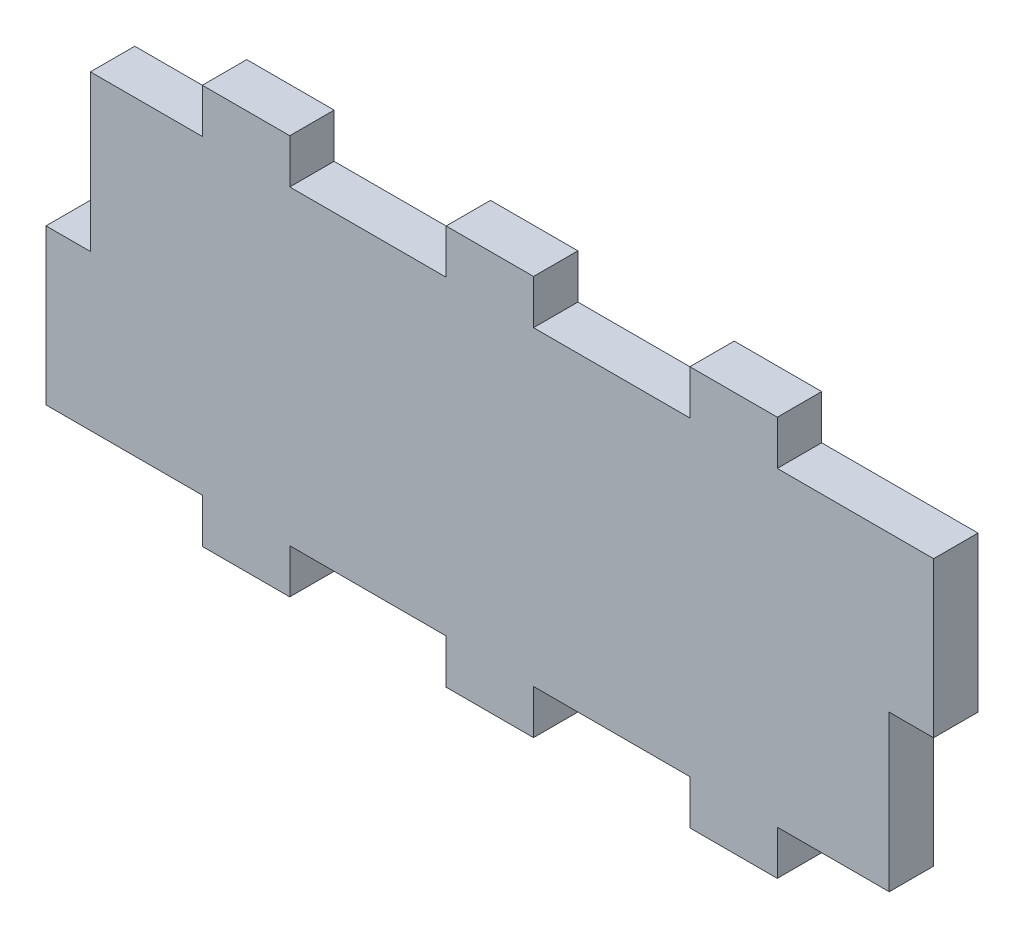
ISO-10303-21;
HEADER;
FILE_DESCRIPTION(('STEP AP214'),'2;1');
FILE_NAME('part.step','',(''),(''),'','','');
FILE_SCHEMA(('AUTOMOTIVE_DESIGN { 1 0 10303 214 1 1 1 1 }'));
ENDSEC;
DATA;
#1=APPLICATION_CONTEXT('core data for automotive mechanical design processes');
#2=APPLICATION_PROTOCOL_DEFINITION('international standard','automotive_design',2000,#1);
#3=PRODUCT_CONTEXT('',#1,'mechanical');
#4=PRODUCT('Part','Part','',(#3));
#5=PRODUCT_RELATED_PRODUCT_CATEGORY('part','',(#4));
#6=PRODUCT_DEFINITION_FORMATION('','',#4);
#7=PRODUCT_DEFINITION_CONTEXT('part definition',#1,'design');
#8=PRODUCT_DEFINITION('design','',#6,#7);
#9=PRODUCT_DEFINITION_SHAPE('','',#8);
#10=(LENGTH_UNIT() NAMED_UNIT(*) SI_UNIT(.MILLI.,.METRE.));
#11=(NAMED_UNIT(*) PLANE_ANGLE_UNIT() SI_UNIT($,.RADIAN.));
#12=(NAMED_UNIT(*) SI_UNIT($,.STERADIAN.) SOLID_ANGLE_UNIT());
#13=UNCERTAINTY_MEASURE_WITH_UNIT(LENGTH_MEASURE(1.E-05),#10,'distance_accuracy_value','');
#14=(GEOMETRIC_REPRESENTATION_CONTEXT(3) GLOBAL_UNCERTAINTY_ASSIGNED_CONTEXT((#13)) GLOBAL_UNIT_ASSIGNED_CONTEXT((#10,
#11,#12)) REPRESENTATION_CONTEXT('',''));
#15=CARTESIAN_POINT('',(0.,0.,0.));
#16=DIRECTION('',(0.,0.,1.));
#17=DIRECTION('',(1.,0.,0.));
#18=AXIS2_PLACEMENT_3D('',#15,#16,#17);
#19=CARTESIAN_POINT('',(0.,-17.5,5.));
#20=DIRECTION('',(0.,1.,0.));
#21=DIRECTION('',(0.,0.,1.));
#22=AXIS2_PLACEMENT_3D('',#19,#20,#21);
#23=PLANE('',#22);
#24=DIRECTION('',(1.,0.,0.));
#25=VECTOR('',#24,1.);
#26=CARTESIAN_POINT('',(0.,-17.5,0.));
#27=LINE('',#26,#25);
#28=CARTESIAN_POINT('',(-50.,-17.5,0.));
#29=VERTEX_POINT('',#28);
#30=CARTESIAN_POINT('',(-32.3875,-17.5,0.));
#31=VERTEX_POINT('',#30);
#32=EDGE_CURVE('E281',#29,#31,#27,.T.);
#33=ORIENTED_EDGE('',*,*,#32,.T.);
#34=DIRECTION('',(0.,0.,-1.));
#35=VECTOR('',#34,1.);
#36=CARTESIAN_POINT('',(-32.3875,-17.5,5.));
#37=LINE('',#36,#35);
#38=CARTESIAN_POINT('',(-32.3875,-17.5,5.));
#39=VERTEX_POINT('',#38);
#40=EDGE_CURVE('E11',#39,#31,#37,.T.);
#41=ORIENTED_EDGE('',*,*,#40,.F.);
#42=DIRECTION('',(1.,0.,0.));
#43=VECTOR('',#42,1.);
#44=CARTESIAN_POINT('',(0.,-17.5,5.));
#45=LINE('',#44,#43);
#46=CARTESIAN_POINT('',(-50.,-17.5,5.));
#47=VERTEX_POINT('',#46);
#48=EDGE_CURVE('E357',#47,#39,#45,.T.);
#49=ORIENTED_EDGE('',*,*,#48,.F.);
#50=DIRECTION('',(0.,0.,-1.));
#51=VECTOR('',#50,1.);
#52=CARTESIAN_POINT('',(-50.,-17.5,5.));
#53=LINE('',#52,#51);
#54=EDGE_CURVE('E52',#47,#29,#53,.T.);
#55=ORIENTED_EDGE('',*,*,#54,.T.);
#56=EDGE_LOOP('',(#33,#41,#49,#55));
#57=FACE_BOUND('',#56,.T.);
#58=ADVANCED_FACE('F35',(#57),#23,.F.);
#59=CARTESIAN_POINT('',(-32.3875,0.,5.));
#60=DIRECTION('',(1.,0.,0.));
#61=DIRECTION('',(0.,0.,-1.));
#62=AXIS2_PLACEMENT_3D('',#59,#60,#61);
#63=PLANE('',#62);
#64=DIRECTION('',(0.,-1.,0.));
#65=VECTOR('',#64,1.);
#66=CARTESIAN_POINT('',(-32.3875,0.,0.));
#67=LINE('',#66,#65);
#68=CARTESIAN_POINT('',(-32.3875,-22.5,0.));
#69=VERTEX_POINT('',#68);
#70=EDGE_CURVE('E283',#31,#69,#67,.T.);
#71=ORIENTED_EDGE('',*,*,#70,.T.);
#72=DIRECTION('',(0.,0.,-1.));
#73=VECTOR('',#72,1.);
#74=CARTESIAN_POINT('',(-32.3875,-22.5,5.));
#75=LINE('',#74,#73);
#76=CARTESIAN_POINT('',(-32.3875,-22.5,5.));
#77=VERTEX_POINT('',#76);
#78=EDGE_CURVE('E44',#77,#69,#75,.T.);
#79=ORIENTED_EDGE('',*,*,#78,.F.);
#80=DIRECTION('',(0.,-1.,0.));
#81=VECTOR('',#80,1.);
#82=CARTESIAN_POINT('',(-32.3875,0.,5.));
#83=LINE('',#82,#81);
#84=EDGE_CURVE('E163',#39,#77,#83,.T.);
#85=ORIENTED_EDGE('',*,*,#84,.F.);
#86=ORIENTED_EDGE('',*,*,#40,.T.);
#87=EDGE_LOOP('',(#71,#79,#85,#86));
#88=FACE_BOUND('',#87,.T.);
#89=ADVANCED_FACE('F37',(#88),#63,.F.);
#90=CARTESIAN_POINT('',(0.,-22.5,5.));
#91=DIRECTION('',(0.,1.,0.));
#92=DIRECTION('',(0.,0.,1.));
#93=AXIS2_PLACEMENT_3D('',#90,#91,#92);
#94=PLANE('',#93);
#95=DIRECTION('',(1.,0.,0.));
#96=VECTOR('',#95,1.);
#97=CARTESIAN_POINT('',(0.,-22.5,0.));
#98=LINE('',#97,#96);
#99=CARTESIAN_POINT('',(-22.5375,-22.5,0.));
#100=VERTEX_POINT('',#99);
#101=EDGE_CURVE('E287',#69,#100,#98,.T.);
#102=ORIENTED_EDGE('',*,*,#101,.T.);
#103=DIRECTION('',(0.,0.,-1.));
#104=VECTOR('',#103,1.);
#105=CARTESIAN_POINT('',(-22.5375,-22.5,5.));
#106=LINE('',#105,#104);
#107=CARTESIAN_POINT('',(-22.5375,-22.5,5.));
#108=VERTEX_POINT('',#107);
#109=EDGE_CURVE('E417',#108,#100,#106,.T.);
#110=ORIENTED_EDGE('',*,*,#109,.F.);
#111=DIRECTION('',(1.,0.,0.));
#112=VECTOR('',#111,1.);
#113=CARTESIAN_POINT('',(0.,-22.5,5.));
#114=LINE('',#113,#112);
#115=EDGE_CURVE('E424',#77,#108,#114,.T.);
#116=ORIENTED_EDGE('',*,*,#115,.F.);
#117=ORIENTED_EDGE('',*,*,#78,.T.);
#118=EDGE_LOOP('',(#102,#110,#116,#117));
#119=FACE_BOUND('',#118,.T.);
#120=ADVANCED_FACE('F422',(#119),#94,.F.);
#121=CARTESIAN_POINT('',(-22.5375,0.,5.));
#122=DIRECTION('',(1.,0.,0.));
#123=DIRECTION('',(0.,0.,-1.));
#124=AXIS2_PLACEMENT_3D('',#121,#122,#123);
#125=PLANE('',#124);
#126=DIRECTION('',(0.,-1.,0.));
#127=VECTOR('',#126,1.);
#128=CARTESIAN_POINT('',(-22.5375,0.,0.));
#129=LINE('',#128,#127);
#130=CARTESIAN_POINT('',(-22.5375,-17.5,0.));
#131=VERTEX_POINT('',#130);
#132=EDGE_CURVE('E290',#131,#100,#129,.T.);
#133=ORIENTED_EDGE('',*,*,#132,.F.);
#134=DIRECTION('',(0.,0.,-1.));
#135=VECTOR('',#134,1.);
#136=CARTESIAN_POINT('',(-22.5375,-17.5,5.));
#137=LINE('',#136,#135);
#138=CARTESIAN_POINT('',(-22.5375,-17.5,5.));
#139=VERTEX_POINT('',#138);
#140=EDGE_CURVE('E415',#139,#131,#137,.T.);
#141=ORIENTED_EDGE('',*,*,#140,.F.);
#142=DIRECTION('',(0.,-1.,0.));
#143=VECTOR('',#142,1.);
#144=CARTESIAN_POINT('',(-22.5375,0.,5.));
#145=LINE('',#144,#143);
#146=EDGE_CURVE('E435',#139,#108,#145,.T.);
#147=ORIENTED_EDGE('',*,*,#146,.T.);
#148=ORIENTED_EDGE('',*,*,#109,.T.);
#149=EDGE_LOOP('',(#133,#141,#147,#148));
#150=FACE_BOUND('',#149,.T.);
#151=ADVANCED_FACE('F431',(#150),#125,.T.);
#152=CARTESIAN_POINT('',(-4.92499999999999,-17.5,0.));
#153=VERTEX_POINT('',#152);
#154=EDGE_CURVE('E285',#131,#153,#27,.T.);
#155=ORIENTED_EDGE('',*,*,#154,.T.);
#156=DIRECTION('',(0.,0.,-1.));
#157=VECTOR('',#156,1.);
#158=CARTESIAN_POINT('',(-4.92499999999999,-17.5,5.));
#159=LINE('',#158,#157);
#160=CARTESIAN_POINT('',(-4.92499999999999,-17.5,5.));
#161=VERTEX_POINT('',#160);
#162=EDGE_CURVE('E412',#161,#153,#159,.T.);
#163=ORIENTED_EDGE('',*,*,#162,.F.);
#164=EDGE_CURVE('E436',#139,#161,#45,.T.);
#165=ORIENTED_EDGE('',*,*,#164,.F.);
#166=ORIENTED_EDGE('',*,*,#140,.T.);
#167=EDGE_LOOP('',(#155,#163,#165,#166));
#168=FACE_BOUND('',#167,.T.);
#169=ADVANCED_FACE('F511',(#168),#23,.F.);
#170=CARTESIAN_POINT('',(-4.92499999999999,0.,5.));
#171=DIRECTION('',(1.,0.,0.));
#172=DIRECTION('',(0.,0.,-1.));
#173=AXIS2_PLACEMENT_3D('',#170,#171,#172);
#174=PLANE('',#173);
#175=DIRECTION('',(0.,-1.,0.));
#176=VECTOR('',#175,1.);
#177=CARTESIAN_POINT('',(-4.92499999999999,0.,0.));
#178=LINE('',#177,#176);
#179=CARTESIAN_POINT('',(-4.92499999999999,-22.5,0.));
#180=VERTEX_POINT('',#179);
#181=EDGE_CURVE('E293',#153,#180,#178,.T.);
#182=ORIENTED_EDGE('',*,*,#181,.T.);
#183=DIRECTION('',(0.,0.,-1.));
#184=VECTOR('',#183,1.);
#185=CARTESIAN_POINT('',(-4.92499999999999,-22.5,5.));
#186=LINE('',#185,#184);
#187=CARTESIAN_POINT('',(-4.92499999999999,-22.5,5.));
#188=VERTEX_POINT('',#187);
#189=EDGE_CURVE('E409',#188,#180,#186,.T.);
#190=ORIENTED_EDGE('',*,*,#189,.F.);
#191=DIRECTION('',(0.,-1.,0.));
#192=VECTOR('',#191,1.);
#193=CARTESIAN_POINT('',(-4.92499999999999,0.,5.));
#194=LINE('',#193,#192);
#195=EDGE_CURVE('E438',#161,#188,#194,.T.);
#196=ORIENTED_EDGE('',*,*,#195,.F.);
#197=ORIENTED_EDGE('',*,*,#162,.T.);
#198=EDGE_LOOP('',(#182,#190,#196,#197));
#199=FACE_BOUND('',#198,.T.);
#200=ADVANCED_FACE('F519',(#199),#174,.F.);
#201=CARTESIAN_POINT('',(0.,-22.5,5.));
#202=DIRECTION('',(0.,1.,0.));
#203=DIRECTION('',(0.,0.,1.));
#204=AXIS2_PLACEMENT_3D('',#201,#202,#203);
#205=PLANE('',#204);
#206=DIRECTION('',(1.,0.,0.));
#207=VECTOR('',#206,1.);
#208=CARTESIAN_POINT('',(0.,-22.5,0.));
#209=LINE('',#208,#207);
#210=CARTESIAN_POINT('',(4.92500000000001,-22.5,0.));
#211=VERTEX_POINT('',#210);
#212=EDGE_CURVE('E295',#180,#211,#209,.T.);
#213=ORIENTED_EDGE('',*,*,#212,.T.);
#214=DIRECTION('',(0.,0.,-1.));
#215=VECTOR('',#214,1.);
#216=CARTESIAN_POINT('',(4.92500000000001,-22.5,5.));
#217=LINE('',#216,#215);
#218=CARTESIAN_POINT('',(4.92500000000001,-22.5,5.));
#219=VERTEX_POINT('',#218);
#220=EDGE_CURVE('E407',#219,#211,#217,.T.);
#221=ORIENTED_EDGE('',*,*,#220,.F.);
#222=DIRECTION('',(1.,0.,0.));
#223=VECTOR('',#222,1.);
#224=CARTESIAN_POINT('',(0.,-22.5,5.));
#225=LINE('',#224,#223);
#226=EDGE_CURVE('E445',#188,#219,#225,.T.);
#227=ORIENTED_EDGE('',*,*,#226,.F.);
#228=ORIENTED_EDGE('',*,*,#189,.T.);
#229=EDGE_LOOP('',(#213,#221,#227,#228));
#230=FACE_BOUND('',#229,.T.);
#231=ADVANCED_FACE('F544',(#230),#205,.F.);
#232=CARTESIAN_POINT('',(4.92500000000001,0.,5.));
#233=DIRECTION('',(1.,0.,0.));
#234=DIRECTION('',(0.,0.,-1.));
#235=AXIS2_PLACEMENT_3D('',#232,#233,#234);
#236=PLANE('',#235);
#237=DIRECTION('',(0.,-1.,0.));
#238=VECTOR('',#237,1.);
#239=CARTESIAN_POINT('',(4.92500000000001,0.,0.));
#240=LINE('',#239,#238);
#241=CARTESIAN_POINT('',(4.92500000000001,-17.5,0.));
#242=VERTEX_POINT('',#241);
#243=EDGE_CURVE('E298',#242,#211,#240,.T.);
#244=ORIENTED_EDGE('',*,*,#243,.F.);
#245=DIRECTION('',(0.,0.,-1.));
#246=VECTOR('',#245,1.);
#247=CARTESIAN_POINT('',(4.92500000000001,-17.5,5.));
#248=LINE('',#247,#246);
#249=CARTESIAN_POINT('',(4.92500000000001,-17.5,5.));
#250=VERTEX_POINT('',#249);
#251=EDGE_CURVE('E405',#250,#242,#248,.T.);
#252=ORIENTED_EDGE('',*,*,#251,.F.);
#253=DIRECTION('',(0.,-1.,0.));
#254=VECTOR('',#253,1.);
#255=CARTESIAN_POINT('',(4.92500000000001,0.,5.));
#256=LINE('',#255,#254);
#257=EDGE_CURVE('E447',#250,#219,#256,.T.);
#258=ORIENTED_EDGE('',*,*,#257,.T.);
#259=ORIENTED_EDGE('',*,*,#220,.T.);
#260=EDGE_LOOP('',(#244,#252,#258,#259));
#261=FACE_BOUND('',#260,.T.);
#262=ADVANCED_FACE('F536',(#261),#236,.T.);
#263=CARTESIAN_POINT('',(22.5375,-17.5,0.));
#264=VERTEX_POINT('',#263);
#265=EDGE_CURVE('E301',#242,#264,#27,.T.);
#266=ORIENTED_EDGE('',*,*,#265,.T.);
#267=DIRECTION('',(0.,0.,-1.));
#268=VECTOR('',#267,1.);
#269=CARTESIAN_POINT('',(22.5375,-17.5,5.));
#270=LINE('',#269,#268);
#271=CARTESIAN_POINT('',(22.5375,-17.5,5.));
#272=VERTEX_POINT('',#271);
#273=EDGE_CURVE('E402',#272,#264,#270,.T.);
#274=ORIENTED_EDGE('',*,*,#273,.F.);
#275=EDGE_CURVE('E440',#250,#272,#45,.T.);
#276=ORIENTED_EDGE('',*,*,#275,.F.);
#277=ORIENTED_EDGE('',*,*,#251,.T.);
#278=EDGE_LOOP('',(#266,#274,#276,#277));
#279=FACE_BOUND('',#278,.T.);
#280=ADVANCED_FACE('F521',(#279),#23,.F.);
#281=CARTESIAN_POINT('',(22.5375,0.,5.));
#282=DIRECTION('',(1.,0.,0.));
#283=DIRECTION('',(0.,1.,0.));
#284=AXIS2_PLACEMENT_3D('',#281,#282,#283);
#285=PLANE('',#284);
#286=DIRECTION('',(0.,-1.,0.));
#287=VECTOR('',#286,1.);
#288=CARTESIAN_POINT('',(22.5375,0.,0.));
#289=LINE('',#288,#287);
#290=CARTESIAN_POINT('',(22.5375,-22.5,0.));
#291=VERTEX_POINT('',#290);
#292=EDGE_CURVE('E302',#264,#291,#289,.T.);
#293=ORIENTED_EDGE('',*,*,#292,.T.);
#294=DIRECTION('',(0.,0.,-1.));
#295=VECTOR('',#294,1.);
#296=CARTESIAN_POINT('',(22.5375,-22.5,5.));
#297=LINE('',#296,#295);
#298=CARTESIAN_POINT('',(22.5375,-22.5,5.));
#299=VERTEX_POINT('',#298);
#300=EDGE_CURVE('E399',#299,#291,#297,.T.);
#301=ORIENTED_EDGE('',*,*,#300,.F.);
#302=DIRECTION('',(0.,-1.,0.));
#303=VECTOR('',#302,1.);
#304=CARTESIAN_POINT('',(22.5375,0.,5.));
#305=LINE('',#304,#303);
#306=EDGE_CURVE('E450',#272,#299,#305,.T.);
#307=ORIENTED_EDGE('',*,*,#306,.F.);
#308=ORIENTED_EDGE('',*,*,#273,.T.);
#309=EDGE_LOOP('',(#293,#301,#307,#308));
#310=FACE_BOUND('',#309,.T.);
#311=ADVANCED_FACE('F535',(#310),#285,.F.);
#312=CARTESIAN_POINT('',(0.,-22.5,5.));
#313=DIRECTION('',(0.,1.,0.));
#314=DIRECTION('',(0.,0.,1.));
#315=AXIS2_PLACEMENT_3D('',#312,#313,#314);
#316=PLANE('',#315);
#317=DIRECTION('',(1.,0.,0.));
#318=VECTOR('',#317,1.);
#319=CARTESIAN_POINT('',(0.,-22.5,0.));
#320=LINE('',#319,#318);
#321=CARTESIAN_POINT('',(32.3875,-22.5,0.));
#322=VERTEX_POINT('',#321);
#323=EDGE_CURVE('E304',#291,#322,#320,.T.);
#324=ORIENTED_EDGE('',*,*,#323,.T.);
#325=DIRECTION('',(0.,0.,-1.));
#326=VECTOR('',#325,1.);
#327=CARTESIAN_POINT('',(32.3875,-22.5,5.));
#328=LINE('',#327,#326);
#329=CARTESIAN_POINT('',(32.3875,-22.5,5.));
#330=VERTEX_POINT('',#329);
#331=EDGE_CURVE('E397',#330,#322,#328,.T.);
#332=ORIENTED_EDGE('',*,*,#331,.F.);
#333=DIRECTION('',(1.,0.,0.));
#334=VECTOR('',#333,1.);
#335=CARTESIAN_POINT('',(0.,-22.5,5.));
#336=LINE('',#335,#334);
#337=EDGE_CURVE('E452',#299,#330,#336,.T.);
#338=ORIENTED_EDGE('',*,*,#337,.F.);
#339=ORIENTED_EDGE('',*,*,#300,.T.);
#340=EDGE_LOOP('',(#324,#332,#338,#339));
#341=FACE_BOUND('',#340,.T.);
#342=ADVANCED_FACE('F532',(#341),#316,.F.);
#343=CARTESIAN_POINT('',(32.3875,0.,5.));
#344=DIRECTION('',(1.,0.,0.));
#345=DIRECTION('',(0.,0.,-1.));
#346=AXIS2_PLACEMENT_3D('',#343,#344,#345);
#347=PLANE('',#346);
#348=DIRECTION('',(0.,-1.,0.));
#349=VECTOR('',#348,1.);
#350=CARTESIAN_POINT('',(32.3875,0.,0.));
#351=LINE('',#350,#349);
#352=CARTESIAN_POINT('',(32.3875,-17.5,0.));
#353=VERTEX_POINT('',#352);
#354=EDGE_CURVE('E307',#353,#322,#351,.T.);
#355=ORIENTED_EDGE('',*,*,#354,.F.);
#356=DIRECTION('',(0.,0.,-1.));
#357=VECTOR('',#356,1.);
#358=CARTESIAN_POINT('',(32.3875,-17.5,5.));
#359=LINE('',#358,#357);
#360=CARTESIAN_POINT('',(32.3875,-17.5,5.));
#361=VERTEX_POINT('',#360);
#362=EDGE_CURVE('E395',#361,#353,#359,.T.);
#363=ORIENTED_EDGE('',*,*,#362,.F.);
#364=DIRECTION('',(0.,-1.,0.));
#365=VECTOR('',#364,1.);
#366=CARTESIAN_POINT('',(32.3875,0.,5.));
#367=LINE('',#366,#365);
#368=EDGE_CURVE('E454',#361,#330,#367,.T.);
#369=ORIENTED_EDGE('',*,*,#368,.T.);
#370=ORIENTED_EDGE('',*,*,#331,.T.);
#371=EDGE_LOOP('',(#355,#363,#369,#370));
#372=FACE_BOUND('',#371,.T.);
#373=ADVANCED_FACE('F524',(#372),#347,.T.);
#374=CARTESIAN_POINT('',(45.,-17.5,0.));
#375=VERTEX_POINT('',#374);
#376=EDGE_CURVE('E284',#353,#375,#27,.T.);
#377=ORIENTED_EDGE('',*,*,#376,.T.);
#378=DIRECTION('',(0.,0.,-1.));
#379=VECTOR('',#378,1.);
#380=CARTESIAN_POINT('',(45.,-17.5,5.));
#381=LINE('',#380,#379);
#382=CARTESIAN_POINT('',(45.,-17.5,5.));
#383=VERTEX_POINT('',#382);
#384=EDGE_CURVE('E392',#383,#375,#381,.T.);
#385=ORIENTED_EDGE('',*,*,#384,.F.);
#386=EDGE_CURVE('E457',#361,#383,#45,.T.);
#387=ORIENTED_EDGE('',*,*,#386,.F.);
#388=ORIENTED_EDGE('',*,*,#362,.T.);
#389=EDGE_LOOP('',(#377,#385,#387,#388));
#390=FACE_BOUND('',#389,.T.);
#391=ADVANCED_FACE('F512',(#390),#23,.F.);
#392=CARTESIAN_POINT('',(45.,0.,5.));
#393=DIRECTION('',(-1.,0.,0.));
#394=DIRECTION('',(0.,0.,1.));
#395=AXIS2_PLACEMENT_3D('',#392,#393,#394);
#396=PLANE('',#395);
#397=DIRECTION('',(0.,1.,0.));
#398=VECTOR('',#397,1.);
#399=CARTESIAN_POINT('',(45.,0.,0.));
#400=LINE('',#399,#398);
#401=CARTESIAN_POINT('',(45.,0.0249999999999972,0.));
#402=VERTEX_POINT('',#401);
#403=EDGE_CURVE('E310',#375,#402,#400,.T.);
#404=ORIENTED_EDGE('',*,*,#403,.T.);
#405=DIRECTION('',(0.,0.,-1.));
#406=VECTOR('',#405,1.);
#407=CARTESIAN_POINT('',(45.,0.0249999999999972,5.));
#408=LINE('',#407,#406);
#409=CARTESIAN_POINT('',(45.,0.0249999999999972,5.));
#410=VERTEX_POINT('',#409);
#411=EDGE_CURVE('E389',#410,#402,#408,.T.);
#412=ORIENTED_EDGE('',*,*,#411,.F.);
#413=DIRECTION('',(0.,1.,0.));
#414=VECTOR('',#413,1.);
#415=CARTESIAN_POINT('',(45.,0.,5.));
#416=LINE('',#415,#414);
#417=EDGE_CURVE('E458',#383,#410,#416,.T.);
#418=ORIENTED_EDGE('',*,*,#417,.F.);
#419=ORIENTED_EDGE('',*,*,#384,.T.);
#420=EDGE_LOOP('',(#404,#412,#418,#419));
#421=FACE_BOUND('',#420,.T.);
#422=ADVANCED_FACE('F523',(#421),#396,.F.);
#423=CARTESIAN_POINT('',(0.,0.0249999999999972,5.));
#424=DIRECTION('',(0.,1.,0.));
#425=DIRECTION('',(0.,0.,1.));
#426=AXIS2_PLACEMENT_3D('',#423,#424,#425);
#427=PLANE('',#426);
#428=DIRECTION('',(1.,0.,0.));
#429=VECTOR('',#428,1.);
#430=CARTESIAN_POINT('',(0.,0.0249999999999972,0.));
#431=LINE('',#430,#429);
#432=CARTESIAN_POINT('',(50.,0.0249999999999972,0.));
#433=VERTEX_POINT('',#432);
#434=EDGE_CURVE('E312',#402,#433,#431,.T.);
#435=ORIENTED_EDGE('',*,*,#434,.T.);
#436=DIRECTION('',(0.,0.,-1.));
#437=VECTOR('',#436,1.);
#438=CARTESIAN_POINT('',(50.,0.0249999999999972,5.));
#439=LINE('',#438,#437);
#440=CARTESIAN_POINT('',(50.,0.0249999999999972,5.));
#441=VERTEX_POINT('',#440);
#442=EDGE_CURVE('E387',#441,#433,#439,.T.);
#443=ORIENTED_EDGE('',*,*,#442,.F.);
#444=DIRECTION('',(1.,0.,0.));
#445=VECTOR('',#444,1.);
#446=CARTESIAN_POINT('',(0.,0.0249999999999972,5.));
#447=LINE('',#446,#445);
#448=EDGE_CURVE('E460',#410,#441,#447,.T.);
#449=ORIENTED_EDGE('',*,*,#448,.F.);
#450=ORIENTED_EDGE('',*,*,#411,.T.);
#451=EDGE_LOOP('',(#435,#443,#449,#450));
#452=FACE_BOUND('',#451,.T.);
#453=ADVANCED_FACE('F530',(#452),#427,.F.);
#454=CARTESIAN_POINT('',(50.,0.,5.));
#455=DIRECTION('',(1.,0.,0.));
#456=DIRECTION('',(0.,1.,0.));
#457=AXIS2_PLACEMENT_3D('',#454,#455,#456);
#458=PLANE('',#457);
#459=DIRECTION('',(0.,-1.,0.));
#460=VECTOR('',#459,1.);
#461=CARTESIAN_POINT('',(50.,0.,0.));
#462=LINE('',#461,#460);
#463=CARTESIAN_POINT('',(50.,17.5,0.));
#464=VERTEX_POINT('',#463);
#465=EDGE_CURVE('E315',#464,#433,#462,.T.);
#466=ORIENTED_EDGE('',*,*,#465,.F.);
#467=DIRECTION('',(0.,0.,-1.));
#468=VECTOR('',#467,1.);
#469=CARTESIAN_POINT('',(50.,17.5,5.));
#470=LINE('',#469,#468);
#471=CARTESIAN_POINT('',(50.,17.5,5.));
#472=VERTEX_POINT('',#471);
#473=EDGE_CURVE('E385',#472,#464,#470,.T.);
#474=ORIENTED_EDGE('',*,*,#473,.F.);
#475=DIRECTION('',(0.,-1.,0.));
#476=VECTOR('',#475,1.);
#477=CARTESIAN_POINT('',(50.,0.,5.));
#478=LINE('',#477,#476);
#479=EDGE_CURVE('E462',#472,#441,#478,.T.);
#480=ORIENTED_EDGE('',*,*,#479,.T.);
#481=ORIENTED_EDGE('',*,*,#442,.T.);
#482=EDGE_LOOP('',(#466,#474,#480,#481));
#483=FACE_BOUND('',#482,.T.);
#484=ADVANCED_FACE('F634',(#483),#458,.T.);
#485=CARTESIAN_POINT('',(0.,17.5,5.));
#486=DIRECTION('',(0.,1.,0.));
#487=DIRECTION('',(0.,0.,1.));
#488=AXIS2_PLACEMENT_3D('',#485,#486,#487);
#489=PLANE('',#488);
#490=DIRECTION('',(1.,0.,0.));
#491=VECTOR('',#490,1.);
#492=CARTESIAN_POINT('',(0.,17.5,0.));
#493=LINE('',#492,#491);
#494=CARTESIAN_POINT('',(32.3874999999999,17.5,0.));
#495=VERTEX_POINT('',#494);
#496=EDGE_CURVE('E318',#495,#464,#493,.T.);
#497=ORIENTED_EDGE('',*,*,#496,.F.);
#498=DIRECTION('',(0.,0.,-1.));
#499=VECTOR('',#498,1.);
#500=CARTESIAN_POINT('',(32.3874999999999,17.5,5.));
#501=LINE('',#500,#499);
#502=CARTESIAN_POINT('',(32.3874999999999,17.5,5.));
#503=VERTEX_POINT('',#502);
#504=EDGE_CURVE('E383',#503,#495,#501,.T.);
#505=ORIENTED_EDGE('',*,*,#504,.F.);
#506=DIRECTION('',(1.,0.,0.));
#507=VECTOR('',#506,1.);
#508=CARTESIAN_POINT('',(0.,17.5,5.));
#509=LINE('',#508,#507);
#510=EDGE_CURVE('E276',#503,#472,#509,.T.);
#511=ORIENTED_EDGE('',*,*,#510,.T.);
#512=ORIENTED_EDGE('',*,*,#473,.T.);
#513=EDGE_LOOP('',(#497,#505,#511,#512));
#514=FACE_BOUND('',#513,.T.);
#515=ADVANCED_FACE('F578',(#514),#489,.T.);
#516=CARTESIAN_POINT('',(32.3874999999999,0.,5.));
#517=DIRECTION('',(1.,0.,0.));
#518=DIRECTION('',(0.,0.,-1.));
#519=AXIS2_PLACEMENT_3D('',#516,#517,#518);
#520=PLANE('',#519);
#521=DIRECTION('',(0.,-1.,0.));
#522=VECTOR('',#521,1.);
#523=CARTESIAN_POINT('',(32.3874999999999,0.,0.));
#524=LINE('',#523,#522);
#525=CARTESIAN_POINT('',(32.3874999999999,22.5,0.));
#526=VERTEX_POINT('',#525);
#527=EDGE_CURVE('E321',#526,#495,#524,.T.);
#528=ORIENTED_EDGE('',*,*,#527,.F.);
#529=DIRECTION('',(0.,0.,-1.));
#530=VECTOR('',#529,1.);
#531=CARTESIAN_POINT('',(32.3874999999999,22.5,5.));
#532=LINE('',#531,#530);
#533=CARTESIAN_POINT('',(32.3874999999999,22.5,5.));
#534=VERTEX_POINT('',#533);
#535=EDGE_CURVE('E381',#534,#526,#532,.T.);
#536=ORIENTED_EDGE('',*,*,#535,.F.);
#537=DIRECTION('',(0.,-1.,0.));
#538=VECTOR('',#537,1.);
#539=CARTESIAN_POINT('',(32.3874999999999,0.,5.));
#540=LINE('',#539,#538);
#541=EDGE_CURVE('E466',#534,#503,#540,.T.);
#542=ORIENTED_EDGE('',*,*,#541,.T.);
#543=ORIENTED_EDGE('',*,*,#504,.T.);
#544=EDGE_LOOP('',(#528,#536,#542,#543));
#545=FACE_BOUND('',#544,.T.);
#546=ADVANCED_FACE('F582',(#545),#520,.T.);
#547=CARTESIAN_POINT('',(0.,22.5,5.));
#548=DIRECTION('',(0.,1.,0.));
#549=DIRECTION('',(-1.,0.,0.));
#550=AXIS2_PLACEMENT_3D('',#547,#548,#549);
#551=PLANE('',#550);
#552=DIRECTION('',(1.,0.,0.));
#553=VECTOR('',#552,1.);
#554=CARTESIAN_POINT('',(0.,22.5,0.));
#555=LINE('',#554,#553);
#556=CARTESIAN_POINT('',(22.5374999999999,22.5,0.));
#557=VERTEX_POINT('',#556);
#558=EDGE_CURVE('E326',#557,#526,#555,.T.);
#559=ORIENTED_EDGE('',*,*,#558,.F.);
#560=DIRECTION('',(0.,0.,-1.));
#561=VECTOR('',#560,1.);
#562=CARTESIAN_POINT('',(22.5374999999999,22.5,5.));
#563=LINE('',#562,#561);
#564=CARTESIAN_POINT('',(22.5374999999999,22.5,5.));
#565=VERTEX_POINT('',#564);
#566=EDGE_CURVE('E379',#565,#557,#563,.T.);
#567=ORIENTED_EDGE('',*,*,#566,.F.);
#568=DIRECTION('',(1.,0.,0.));
#569=VECTOR('',#568,1.);
#570=CARTESIAN_POINT('',(0.,22.5,5.));
#571=LINE('',#570,#569);
#572=EDGE_CURVE('E470',#565,#534,#571,.T.);
#573=ORIENTED_EDGE('',*,*,#572,.T.);
#574=ORIENTED_EDGE('',*,*,#535,.T.);
#575=EDGE_LOOP('',(#559,#567,#573,#574));
#576=FACE_BOUND('',#575,.T.);
#577=ADVANCED_FACE('F586',(#576),#551,.T.);
#578=CARTESIAN_POINT('',(22.5374999999999,0.,5.));
#579=DIRECTION('',(1.,0.,0.));
#580=DIRECTION('',(0.,1.,0.));
#581=AXIS2_PLACEMENT_3D('',#578,#579,#580);
#582=PLANE('',#581);
#583=DIRECTION('',(0.,-1.,0.));
#584=VECTOR('',#583,1.);
#585=CARTESIAN_POINT('',(22.5374999999999,0.,0.));
#586=LINE('',#585,#584);
#587=CARTESIAN_POINT('',(22.5374999999999,17.5,0.));
#588=VERTEX_POINT('',#587);
#589=EDGE_CURVE('E329',#557,#588,#586,.T.);
#590=ORIENTED_EDGE('',*,*,#589,.T.);
#591=DIRECTION('',(0.,0.,-1.));
#592=VECTOR('',#591,1.);
#593=CARTESIAN_POINT('',(22.5374999999999,17.5,5.));
#594=LINE('',#593,#592);
#595=CARTESIAN_POINT('',(22.5374999999999,17.5,5.));
#596=VERTEX_POINT('',#595);
#597=EDGE_CURVE('E377',#596,#588,#594,.T.);
#598=ORIENTED_EDGE('',*,*,#597,.F.);
#599=DIRECTION('',(0.,-1.,0.));
#600=VECTOR('',#599,1.);
#601=CARTESIAN_POINT('',(22.5374999999999,0.,5.));
#602=LINE('',#601,#600);
#603=EDGE_CURVE('E473',#565,#596,#602,.T.);
#604=ORIENTED_EDGE('',*,*,#603,.F.);
#605=ORIENTED_EDGE('',*,*,#566,.T.);
#606=EDGE_LOOP('',(#590,#598,#604,#605));
#607=FACE_BOUND('',#606,.T.);
#608=ADVANCED_FACE('F591',(#607),#582,.F.);
#609=CARTESIAN_POINT('',(4.92499999999987,17.5,0.));
#610=VERTEX_POINT('',#609);
#611=EDGE_CURVE('E323',#610,#588,#493,.T.);
#612=ORIENTED_EDGE('',*,*,#611,.F.);
#613=DIRECTION('',(0.,0.,-1.));
#614=VECTOR('',#613,1.);
#615=CARTESIAN_POINT('',(4.92499999999987,17.5,5.));
#616=LINE('',#615,#614);
#617=CARTESIAN_POINT('',(4.92499999999987,17.5,5.));
#618=VERTEX_POINT('',#617);
#619=EDGE_CURVE('E375',#618,#610,#616,.T.);
#620=ORIENTED_EDGE('',*,*,#619,.F.);
#621=EDGE_CURVE('E467',#618,#596,#509,.T.);
#622=ORIENTED_EDGE('',*,*,#621,.T.);
#623=ORIENTED_EDGE('',*,*,#597,.T.);
#624=EDGE_LOOP('',(#612,#620,#622,#623));
#625=FACE_BOUND('',#624,.T.);
#626=ADVANCED_FACE('F621',(#625),#489,.T.);
#627=CARTESIAN_POINT('',(4.92499999999987,0.,5.));
#628=DIRECTION('',(1.,0.,0.));
#629=DIRECTION('',(0.,0.,-1.));
#630=AXIS2_PLACEMENT_3D('',#627,#628,#629);
#631=PLANE('',#630);
#632=DIRECTION('',(0.,-1.,0.));
#633=VECTOR('',#632,1.);
#634=CARTESIAN_POINT('',(4.92499999999987,0.,0.));
#635=LINE('',#634,#633);
#636=CARTESIAN_POINT('',(4.92499999999987,22.5,0.));
#637=VERTEX_POINT('',#636);
#638=EDGE_CURVE('E332',#637,#610,#635,.T.);
#639=ORIENTED_EDGE('',*,*,#638,.F.);
#640=DIRECTION('',(0.,0.,-1.));
#641=VECTOR('',#640,1.);
#642=CARTESIAN_POINT('',(4.92499999999987,22.5,5.));
#643=LINE('',#642,#641);
#644=CARTESIAN_POINT('',(4.92499999999987,22.5,5.));
#645=VERTEX_POINT('',#644);
#646=EDGE_CURVE('E373',#645,#637,#643,.T.);
#647=ORIENTED_EDGE('',*,*,#646,.F.);
#648=DIRECTION('',(0.,-1.,0.));
#649=VECTOR('',#648,1.);
#650=CARTESIAN_POINT('',(4.92499999999987,0.,5.));
#651=LINE('',#650,#649);
#652=EDGE_CURVE('E475',#645,#618,#651,.T.);
#653=ORIENTED_EDGE('',*,*,#652,.T.);
#654=ORIENTED_EDGE('',*,*,#619,.T.);
#655=EDGE_LOOP('',(#639,#647,#653,#654));
#656=FACE_BOUND('',#655,.T.);
#657=ADVANCED_FACE('F599',(#656),#631,.T.);
#658=CARTESIAN_POINT('',(0.,22.5,5.));
#659=DIRECTION('',(0.,1.,0.));
#660=DIRECTION('',(-1.,0.,0.));
#661=AXIS2_PLACEMENT_3D('',#658,#659,#660);
#662=PLANE('',#661);
#663=DIRECTION('',(1.,0.,0.));
#664=VECTOR('',#663,1.);
#665=CARTESIAN_POINT('',(0.,22.5,0.));
#666=LINE('',#665,#664);
#667=CARTESIAN_POINT('',(-4.92500000000013,22.5,0.));
#668=VERTEX_POINT('',#667);
#669=EDGE_CURVE('E335',#668,#637,#666,.T.);
#670=ORIENTED_EDGE('',*,*,#669,.F.);
#671=DIRECTION('',(0.,0.,-1.));
#672=VECTOR('',#671,1.);
#673=CARTESIAN_POINT('',(-4.92500000000013,22.5,5.));
#674=LINE('',#673,#672);
#675=CARTESIAN_POINT('',(-4.92500000000013,22.5,5.));
#676=VERTEX_POINT('',#675);
#677=EDGE_CURVE('E371',#676,#668,#674,.T.);
#678=ORIENTED_EDGE('',*,*,#677,.F.);
#679=DIRECTION('',(1.,0.,0.));
#680=VECTOR('',#679,1.);
#681=CARTESIAN_POINT('',(0.,22.5,5.));
#682=LINE('',#681,#680);
#683=EDGE_CURVE('E478',#676,#645,#682,.T.);
#684=ORIENTED_EDGE('',*,*,#683,.T.);
#685=ORIENTED_EDGE('',*,*,#646,.T.);
#686=EDGE_LOOP('',(#670,#678,#684,#685));
#687=FACE_BOUND('',#686,.T.);
#688=ADVANCED_FACE('F603',(#687),#662,.T.);
#689=CARTESIAN_POINT('',(-4.92500000000013,0.,5.));
#690=DIRECTION('',(1.,0.,0.));
#691=DIRECTION('',(0.,0.,-1.));
#692=AXIS2_PLACEMENT_3D('',#689,#690,#691);
#693=PLANE('',#692);
#694=DIRECTION('',(0.,-1.,0.));
#695=VECTOR('',#694,1.);
#696=CARTESIAN_POINT('',(-4.92500000000013,0.,0.));
#697=LINE('',#696,#695);
#698=CARTESIAN_POINT('',(-4.92500000000013,17.5,0.));
#699=VERTEX_POINT('',#698);
#700=EDGE_CURVE('E338',#668,#699,#697,.T.);
#701=ORIENTED_EDGE('',*,*,#700,.T.);
#702=DIRECTION('',(0.,0.,-1.));
#703=VECTOR('',#702,1.);
#704=CARTESIAN_POINT('',(-4.92500000000013,17.5,5.));
#705=LINE('',#704,#703);
#706=CARTESIAN_POINT('',(-4.92500000000013,17.5,5.));
#707=VERTEX_POINT('',#706);
#708=EDGE_CURVE('E369',#707,#699,#705,.T.);
#709=ORIENTED_EDGE('',*,*,#708,.F.);
#710=DIRECTION('',(0.,-1.,0.));
#711=VECTOR('',#710,1.);
#712=CARTESIAN_POINT('',(-4.92500000000013,0.,5.));
#713=LINE('',#712,#711);
#714=EDGE_CURVE('E481',#676,#707,#713,.T.);
#715=ORIENTED_EDGE('',*,*,#714,.F.);
#716=ORIENTED_EDGE('',*,*,#677,.T.);
#717=EDGE_LOOP('',(#701,#709,#715,#716));
#718=FACE_BOUND('',#717,.T.);
#719=ADVANCED_FACE('F609',(#718),#693,.F.);
#720=CARTESIAN_POINT('',(-22.5375000000001,17.5,0.));
#721=VERTEX_POINT('',#720);
#722=EDGE_CURVE('E341',#721,#699,#493,.T.);
#723=ORIENTED_EDGE('',*,*,#722,.F.);
#724=DIRECTION('',(0.,0.,-1.));
#725=VECTOR('',#724,1.);
#726=CARTESIAN_POINT('',(-22.5375000000001,17.5,5.));
#727=LINE('',#726,#725);
#728=CARTESIAN_POINT('',(-22.5375000000001,17.5,5.));
#729=VERTEX_POINT('',#728);
#730=EDGE_CURVE('E367',#729,#721,#727,.T.);
#731=ORIENTED_EDGE('',*,*,#730,.F.);
#732=EDGE_CURVE('E275',#729,#707,#509,.T.);
#733=ORIENTED_EDGE('',*,*,#732,.T.);
#734=ORIENTED_EDGE('',*,*,#708,.T.);
#735=EDGE_LOOP('',(#723,#731,#733,#734));
#736=FACE_BOUND('',#735,.T.);
#737=ADVANCED_FACE('F614',(#736),#489,.T.);
#738=CARTESIAN_POINT('',(-22.5375000000001,0.,5.));
#739=DIRECTION('',(1.,0.,0.));
#740=DIRECTION('',(0.,0.,-1.));
#741=AXIS2_PLACEMENT_3D('',#738,#739,#740);
#742=PLANE('',#741);
#743=DIRECTION('',(0.,-1.,0.));
#744=VECTOR('',#743,1.);
#745=CARTESIAN_POINT('',(-22.5375000000001,0.,0.));
#746=LINE('',#745,#744);
#747=CARTESIAN_POINT('',(-22.5375000000001,22.5,0.));
#748=VERTEX_POINT('',#747);
#749=EDGE_CURVE('E342',#748,#721,#746,.T.);
#750=ORIENTED_EDGE('',*,*,#749,.F.);
#751=DIRECTION('',(0.,0.,-1.));
#752=VECTOR('',#751,1.);
#753=CARTESIAN_POINT('',(-22.5375000000001,22.5,5.));
#754=LINE('',#753,#752);
#755=CARTESIAN_POINT('',(-22.5375000000001,22.5,5.));
#756=VERTEX_POINT('',#755);
#757=EDGE_CURVE('E365',#756,#748,#754,.T.);
#758=ORIENTED_EDGE('',*,*,#757,.F.);
#759=DIRECTION('',(0.,-1.,0.));
#760=VECTOR('',#759,1.);
#761=CARTESIAN_POINT('',(-22.5375000000001,0.,5.));
#762=LINE('',#761,#760);
#763=EDGE_CURVE('E483',#756,#729,#762,.T.);
#764=ORIENTED_EDGE('',*,*,#763,.T.);
#765=ORIENTED_EDGE('',*,*,#730,.T.);
#766=EDGE_LOOP('',(#750,#758,#764,#765));
#767=FACE_BOUND('',#766,.T.);
#768=ADVANCED_FACE('F617',(#767),#742,.T.);
#769=CARTESIAN_POINT('',(0.,22.5,5.));
#770=DIRECTION('',(0.,1.,0.));
#771=DIRECTION('',(-1.,0.,0.));
#772=AXIS2_PLACEMENT_3D('',#769,#770,#771);
#773=PLANE('',#772);
#774=DIRECTION('',(1.,0.,0.));
#775=VECTOR('',#774,1.);
#776=CARTESIAN_POINT('',(0.,22.5,0.));
#777=LINE('',#776,#775);
#778=CARTESIAN_POINT('',(-32.3875000000001,22.5,0.));
#779=VERTEX_POINT('',#778);
#780=EDGE_CURVE('E345',#779,#748,#777,.T.);
#781=ORIENTED_EDGE('',*,*,#780,.F.);
#782=DIRECTION('',(0.,0.,-1.));
#783=VECTOR('',#782,1.);
#784=CARTESIAN_POINT('',(-32.3875000000001,22.5,5.));
#785=LINE('',#784,#783);
#786=CARTESIAN_POINT('',(-32.3875000000001,22.5,5.));
#787=VERTEX_POINT('',#786);
#788=EDGE_CURVE('E363',#787,#779,#785,.T.);
#789=ORIENTED_EDGE('',*,*,#788,.F.);
#790=DIRECTION('',(1.,0.,0.));
#791=VECTOR('',#790,1.);
#792=CARTESIAN_POINT('',(0.,22.5,5.));
#793=LINE('',#792,#791);
#794=EDGE_CURVE('E485',#787,#756,#793,.T.);
#795=ORIENTED_EDGE('',*,*,#794,.T.);
#796=ORIENTED_EDGE('',*,*,#757,.T.);
#797=EDGE_LOOP('',(#781,#789,#795,#796));
#798=FACE_BOUND('',#797,.T.);
#799=ADVANCED_FACE('F619',(#798),#773,.T.);
#800=CARTESIAN_POINT('',(-32.3875000000001,0.,5.));
#801=DIRECTION('',(1.,0.,0.));
#802=DIRECTION('',(0.,0.,-1.));
#803=AXIS2_PLACEMENT_3D('',#800,#801,#802);
#804=PLANE('',#803);
#805=DIRECTION('',(0.,-1.,0.));
#806=VECTOR('',#805,1.);
#807=CARTESIAN_POINT('',(-32.3875000000001,0.,0.));
#808=LINE('',#807,#806);
#809=CARTESIAN_POINT('',(-32.3875000000001,17.5,0.));
#810=VERTEX_POINT('',#809);
#811=EDGE_CURVE('E348',#779,#810,#808,.T.);
#812=ORIENTED_EDGE('',*,*,#811,.T.);
#813=DIRECTION('',(0.,0.,-1.));
#814=VECTOR('',#813,1.);
#815=CARTESIAN_POINT('',(-32.3875000000001,17.5,5.));
#816=LINE('',#815,#814);
#817=CARTESIAN_POINT('',(-32.3875000000001,17.5,5.));
#818=VERTEX_POINT('',#817);
#819=EDGE_CURVE('E361',#818,#810,#816,.T.);
#820=ORIENTED_EDGE('',*,*,#819,.F.);
#821=DIRECTION('',(0.,-1.,0.));
#822=VECTOR('',#821,1.);
#823=CARTESIAN_POINT('',(-32.3875000000001,0.,5.));
#824=LINE('',#823,#822);
#825=EDGE_CURVE('E273',#787,#818,#824,.T.);
#826=ORIENTED_EDGE('',*,*,#825,.F.);
#827=ORIENTED_EDGE('',*,*,#788,.T.);
#828=EDGE_LOOP('',(#812,#820,#826,#827));
#829=FACE_BOUND('',#828,.T.);
#830=ADVANCED_FACE('F493',(#829),#804,.F.);
#831=CARTESIAN_POINT('',(-45.,17.5,0.));
#832=VERTEX_POINT('',#831);
#833=EDGE_CURVE('E322',#832,#810,#493,.T.);
#834=ORIENTED_EDGE('',*,*,#833,.F.);
#835=DIRECTION('',(0.,0.,-1.));
#836=VECTOR('',#835,1.);
#837=CARTESIAN_POINT('',(-45.,17.5,5.));
#838=LINE('',#837,#836);
#839=CARTESIAN_POINT('',(-45.,17.5,5.));
#840=VERTEX_POINT('',#839);
#841=EDGE_CURVE('E260',#840,#832,#838,.T.);
#842=ORIENTED_EDGE('',*,*,#841,.F.);
#843=EDGE_CURVE('E271',#840,#818,#509,.T.);
#844=ORIENTED_EDGE('',*,*,#843,.T.);
#845=ORIENTED_EDGE('',*,*,#819,.T.);
#846=EDGE_LOOP('',(#834,#842,#844,#845));
#847=FACE_BOUND('',#846,.T.);
#848=ADVANCED_FACE('F498',(#847),#489,.T.);
#849=CARTESIAN_POINT('',(-45.,0.,5.));
#850=DIRECTION('',(-1.,0.,0.));
#851=DIRECTION('',(0.,0.,1.));
#852=AXIS2_PLACEMENT_3D('',#849,#850,#851);
#853=PLANE('',#852);
#854=DIRECTION('',(0.,1.,0.));
#855=VECTOR('',#854,1.);
#856=CARTESIAN_POINT('',(-45.,0.,0.));
#857=LINE('',#856,#855);
#858=CARTESIAN_POINT('',(-45.,-0.0250000000000051,0.));
#859=VERTEX_POINT('',#858);
#860=EDGE_CURVE('E257',#859,#832,#857,.T.);
#861=ORIENTED_EDGE('',*,*,#860,.F.);
#862=DIRECTION('',(0.,0.,-1.));
#863=VECTOR('',#862,1.);
#864=CARTESIAN_POINT('',(-45.,-0.0250000000000051,5.));
#865=LINE('',#864,#863);
#866=CARTESIAN_POINT('',(-45.,-0.0250000000000051,5.));
#867=VERTEX_POINT('',#866);
#868=EDGE_CURVE('E251',#867,#859,#865,.T.);
#869=ORIENTED_EDGE('',*,*,#868,.F.);
#870=DIRECTION('',(0.,1.,0.));
#871=VECTOR('',#870,1.);
#872=CARTESIAN_POINT('',(-45.,0.,5.));
#873=LINE('',#872,#871);
#874=EDGE_CURVE('E255',#867,#840,#873,.T.);
#875=ORIENTED_EDGE('',*,*,#874,.T.);
#876=ORIENTED_EDGE('',*,*,#841,.T.);
#877=EDGE_LOOP('',(#861,#869,#875,#876));
#878=FACE_BOUND('',#877,.T.);
#879=ADVANCED_FACE('F253',(#878),#853,.T.);
#880=CARTESIAN_POINT('',(0.,-0.0249999999999995,5.));
#881=DIRECTION('',(0.,-1.,0.));
#882=DIRECTION('',(1.,0.,0.));
#883=AXIS2_PLACEMENT_3D('',#880,#881,#882);
#884=PLANE('',#883);
#885=DIRECTION('',(-1.,0.,0.));
#886=VECTOR('',#885,1.);
#887=CARTESIAN_POINT('',(0.,-0.0249999999999995,0.));
#888=LINE('',#887,#886);
#889=CARTESIAN_POINT('',(-50.,-0.0250000000000057,0.));
#890=VERTEX_POINT('',#889);
#891=EDGE_CURVE('E352',#859,#890,#888,.T.);
#892=ORIENTED_EDGE('',*,*,#891,.T.);
#893=DIRECTION('',(0.,0.,-1.));
#894=VECTOR('',#893,1.);
#895=CARTESIAN_POINT('',(-50.,-0.0250000000000057,5.));
#896=LINE('',#895,#894);
#897=CARTESIAN_POINT('',(-50.,-0.0250000000000057,5.));
#898=VERTEX_POINT('',#897);
#899=EDGE_CURVE('E151',#898,#890,#896,.T.);
#900=ORIENTED_EDGE('',*,*,#899,.F.);
#901=DIRECTION('',(-1.,0.,0.));
#902=VECTOR('',#901,1.);
#903=CARTESIAN_POINT('',(0.,-0.0249999999999995,5.));
#904=LINE('',#903,#902);
#905=EDGE_CURVE('E262',#867,#898,#904,.T.);
#906=ORIENTED_EDGE('',*,*,#905,.F.);
#907=ORIENTED_EDGE('',*,*,#868,.T.);
#908=EDGE_LOOP('',(#892,#900,#906,#907));
#909=FACE_BOUND('',#908,.T.);
#910=ADVANCED_FACE('F263',(#909),#884,.F.);
#911=CARTESIAN_POINT('',(-50.,0.,5.));
#912=DIRECTION('',(-1.,0.,0.));
#913=DIRECTION('',(0.,0.,1.));
#914=AXIS2_PLACEMENT_3D('',#911,#912,#913);
#915=PLANE('',#914);
#916=DIRECTION('',(0.,1.,0.));
#917=VECTOR('',#916,1.);
#918=CARTESIAN_POINT('',(-50.,0.,0.));
#919=LINE('',#918,#917);
#920=EDGE_CURVE('E354',#29,#890,#919,.T.);
#921=ORIENTED_EDGE('',*,*,#920,.F.);
#922=ORIENTED_EDGE('',*,*,#54,.F.);
#923=DIRECTION('',(0.,1.,0.));
#924=VECTOR('',#923,1.);
#925=CARTESIAN_POINT('',(-50.,0.,5.));
#926=LINE('',#925,#924);
#927=EDGE_CURVE('E266',#47,#898,#926,.T.);
#928=ORIENTED_EDGE('',*,*,#927,.T.);
#929=ORIENTED_EDGE('',*,*,#899,.T.);
#930=EDGE_LOOP('',(#921,#922,#928,#929));
#931=FACE_BOUND('',#930,.T.);
#932=ADVANCED_FACE('F499',(#931),#915,.T.);
#933=CARTESIAN_POINT('',(0.,0.,5.));
#934=DIRECTION('',(0.,0.,1.));
#935=DIRECTION('',(1.,0.,0.));
#936=AXIS2_PLACEMENT_3D('',#933,#934,#935);
#937=PLANE('',#936);
#938=ORIENTED_EDGE('',*,*,#48,.T.);
#939=ORIENTED_EDGE('',*,*,#84,.T.);
#940=ORIENTED_EDGE('',*,*,#115,.T.);
#941=ORIENTED_EDGE('',*,*,#146,.F.);
#942=ORIENTED_EDGE('',*,*,#164,.T.);
#943=ORIENTED_EDGE('',*,*,#195,.T.);
#944=ORIENTED_EDGE('',*,*,#226,.T.);
#945=ORIENTED_EDGE('',*,*,#257,.F.);
#946=ORIENTED_EDGE('',*,*,#275,.T.);
#947=ORIENTED_EDGE('',*,*,#306,.T.);
#948=ORIENTED_EDGE('',*,*,#337,.T.);
#949=ORIENTED_EDGE('',*,*,#368,.F.);
#950=ORIENTED_EDGE('',*,*,#386,.T.);
#951=ORIENTED_EDGE('',*,*,#417,.T.);
#952=ORIENTED_EDGE('',*,*,#448,.T.);
#953=ORIENTED_EDGE('',*,*,#479,.F.);
#954=ORIENTED_EDGE('',*,*,#510,.F.);
#955=ORIENTED_EDGE('',*,*,#541,.F.);
#956=ORIENTED_EDGE('',*,*,#572,.F.);
#957=ORIENTED_EDGE('',*,*,#603,.T.);
#958=ORIENTED_EDGE('',*,*,#621,.F.);
#959=ORIENTED_EDGE('',*,*,#652,.F.);
#960=ORIENTED_EDGE('',*,*,#683,.F.);
#961=ORIENTED_EDGE('',*,*,#714,.T.);
#962=ORIENTED_EDGE('',*,*,#732,.F.);
#963=ORIENTED_EDGE('',*,*,#763,.F.);
#964=ORIENTED_EDGE('',*,*,#794,.F.);
#965=ORIENTED_EDGE('',*,*,#825,.T.);
#966=ORIENTED_EDGE('',*,*,#843,.F.);
#967=ORIENTED_EDGE('',*,*,#874,.F.);
#968=ORIENTED_EDGE('',*,*,#905,.T.);
#969=ORIENTED_EDGE('',*,*,#927,.F.);
#970=EDGE_LOOP('',(#938,#939,#940,#941,#942,#943,#944,#945,#946,#947,#948,#949,#950,#951,#952,
#953,#954,#955,#956,#957,#958,#959,#960,#961,#962,#963,#964,#965,#966,#967,#968,#969));
#971=FACE_BOUND('',#970,.T.);
#972=ADVANCED_FACE('F269',(#971),#937,.T.);
#973=CARTESIAN_POINT('',(0.,0.,0.));
#974=DIRECTION('',(0.,0.,1.));
#975=DIRECTION('',(1.,0.,0.));
#976=AXIS2_PLACEMENT_3D('',#973,#974,#975);
#977=PLANE('',#976);
#978=ORIENTED_EDGE('',*,*,#32,.F.);
#979=ORIENTED_EDGE('',*,*,#920,.T.);
#980=ORIENTED_EDGE('',*,*,#891,.F.);
#981=ORIENTED_EDGE('',*,*,#860,.T.);
#982=ORIENTED_EDGE('',*,*,#833,.T.);
#983=ORIENTED_EDGE('',*,*,#811,.F.);
#984=ORIENTED_EDGE('',*,*,#780,.T.);
#985=ORIENTED_EDGE('',*,*,#749,.T.);
#986=ORIENTED_EDGE('',*,*,#722,.T.);
#987=ORIENTED_EDGE('',*,*,#700,.F.);
#988=ORIENTED_EDGE('',*,*,#669,.T.);
#989=ORIENTED_EDGE('',*,*,#638,.T.);
#990=ORIENTED_EDGE('',*,*,#611,.T.);
#991=ORIENTED_EDGE('',*,*,#589,.F.);
#992=ORIENTED_EDGE('',*,*,#558,.T.);
#993=ORIENTED_EDGE('',*,*,#527,.T.);
#994=ORIENTED_EDGE('',*,*,#496,.T.);
#995=ORIENTED_EDGE('',*,*,#465,.T.);
#996=ORIENTED_EDGE('',*,*,#434,.F.);
#997=ORIENTED_EDGE('',*,*,#403,.F.);
#998=ORIENTED_EDGE('',*,*,#376,.F.);
#999=ORIENTED_EDGE('',*,*,#354,.T.);
#1000=ORIENTED_EDGE('',*,*,#323,.F.);
#1001=ORIENTED_EDGE('',*,*,#292,.F.);
#1002=ORIENTED_EDGE('',*,*,#265,.F.);
#1003=ORIENTED_EDGE('',*,*,#243,.T.);
#1004=ORIENTED_EDGE('',*,*,#212,.F.);
#1005=ORIENTED_EDGE('',*,*,#181,.F.);
#1006=ORIENTED_EDGE('',*,*,#154,.F.);
#1007=ORIENTED_EDGE('',*,*,#132,.T.);
#1008=ORIENTED_EDGE('',*,*,#101,.F.);
#1009=ORIENTED_EDGE('',*,*,#70,.F.);
#1010=EDGE_LOOP('',(#978,#979,#980,#981,#982,#983,#984,#985,#986,#987,#988,#989,#990,#991,#992,
#993,#994,#995,#996,#997,#998,#999,#1000,#1001,#1002,#1003,#1004,#1005,#1006,#1007,#1008,#1009));
#1011=FACE_BOUND('',#1010,.T.);
#1012=ADVANCED_FACE('F426',(#1011),#977,.F.);
#1013=CLOSED_SHELL('',(#58,#89,#120,#151,#169,#200,#231,#262,#280,#311,#342,#373,#391,#422,#453,
#484,#515,#546,#577,#608,#626,#657,#688,#719,#737,#768,#799,#830,#848,#879,#910,#932,#972,#1012));
#1014=MANIFOLD_SOLID_BREP('B2',#1013);
#1015=ADVANCED_BREP_SHAPE_REPRESENTATION('',(#18,#1014),#14);
#1016=SHAPE_DEFINITION_REPRESENTATION(#9,#1015);
ENDSEC;
END-ISO-10303-21;
